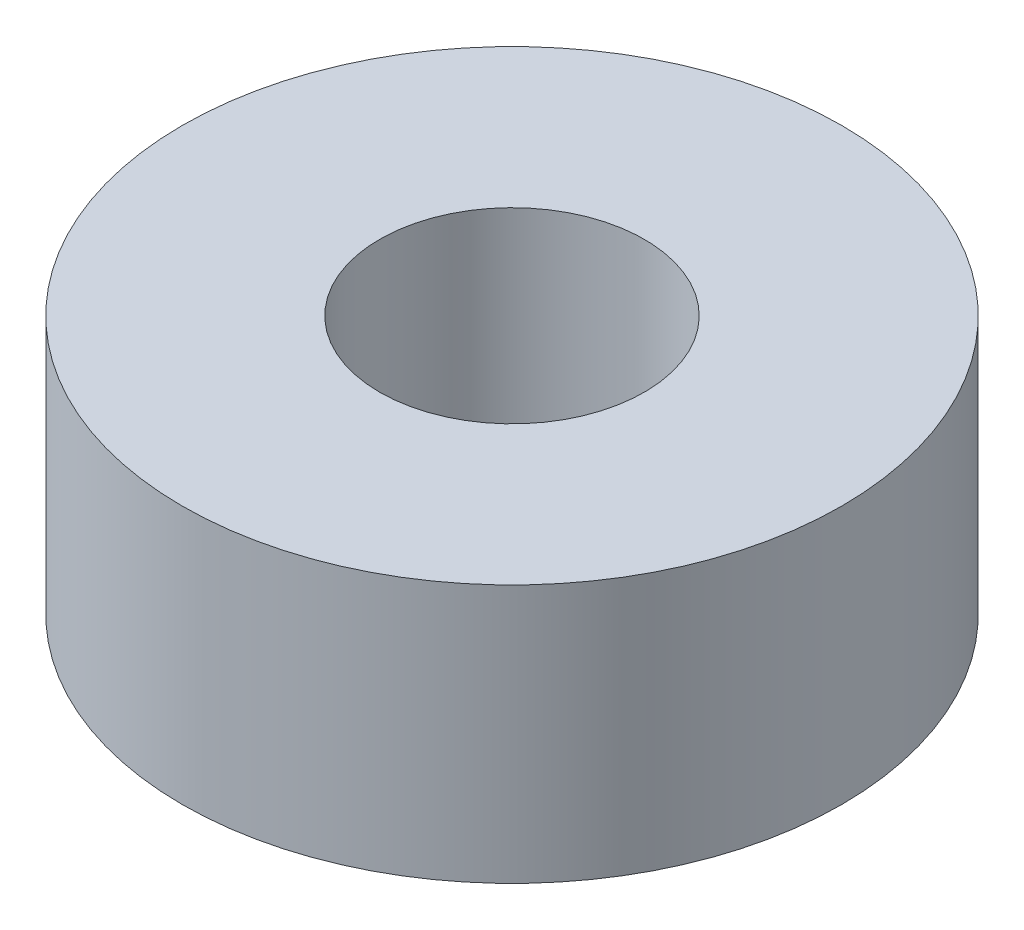
ISO-10303-21;
HEADER;
FILE_DESCRIPTION(('STEP AP214'),'2;1');
FILE_NAME('part.step','',(''),(''),'','','');
FILE_SCHEMA(('AUTOMOTIVE_DESIGN { 1 0 10303 214 1 1 1 1 }'));
ENDSEC;
DATA;
#1=APPLICATION_CONTEXT('core data for automotive mechanical design processes');
#2=APPLICATION_PROTOCOL_DEFINITION('international standard','automotive_design',2000,#1);
#3=PRODUCT_CONTEXT('',#1,'mechanical');
#4=PRODUCT('Part','Part','',(#3));
#5=PRODUCT_RELATED_PRODUCT_CATEGORY('part','',(#4));
#6=PRODUCT_DEFINITION_FORMATION('','',#4);
#7=PRODUCT_DEFINITION_CONTEXT('part definition',#1,'design');
#8=PRODUCT_DEFINITION('design','',#6,#7);
#9=PRODUCT_DEFINITION_SHAPE('','',#8);
#10=(LENGTH_UNIT() NAMED_UNIT(*) SI_UNIT(.MILLI.,.METRE.));
#11=(NAMED_UNIT(*) PLANE_ANGLE_UNIT() SI_UNIT($,.RADIAN.));
#12=(NAMED_UNIT(*) SI_UNIT($,.STERADIAN.) SOLID_ANGLE_UNIT());
#13=UNCERTAINTY_MEASURE_WITH_UNIT(LENGTH_MEASURE(1.E-05),#10,'distance_accuracy_value','');
#14=(GEOMETRIC_REPRESENTATION_CONTEXT(3) GLOBAL_UNCERTAINTY_ASSIGNED_CONTEXT((#13)) GLOBAL_UNIT_ASSIGNED_CONTEXT((#10,
#11,#12)) REPRESENTATION_CONTEXT('',''));
#15=CARTESIAN_POINT('',(0.,0.,0.));
#16=DIRECTION('',(0.,0.,1.));
#17=DIRECTION('',(1.,0.,0.));
#18=AXIS2_PLACEMENT_3D('',#15,#16,#17);
#19=CARTESIAN_POINT('',(0.,4.9784,0.));
#20=DIRECTION('',(0.,1.,0.));
#21=DIRECTION('',(0.,0.,1.));
#22=AXIS2_PLACEMENT_3D('',#19,#20,#21);
#23=PLANE('',#22);
#24=CARTESIAN_POINT('',(0.,4.9784,0.));
#25=DIRECTION('',(0.,1.,0.));
#26=DIRECTION('',(0.,0.,1.));
#27=AXIS2_PLACEMENT_3D('',#24,#25,#26);
#28=CIRCLE('',#27,6.35);
#29=CARTESIAN_POINT('',(0.,4.9784,6.35));
#30=VERTEX_POINT('',#29);
#31=EDGE_CURVE('E10',#30,#30,#28,.T.);
#32=ORIENTED_EDGE('',*,*,#31,.T.);
#33=EDGE_LOOP('',(#32));
#34=FACE_BOUND('',#33,.T.);
#35=CARTESIAN_POINT('',(0.,4.9784,0.));
#36=DIRECTION('',(0.,1.,0.));
#37=DIRECTION('',(0.,0.,1.));
#38=AXIS2_PLACEMENT_3D('',#35,#36,#37);
#39=CIRCLE('',#38,2.55);
#40=CARTESIAN_POINT('',(0.,4.9784,2.55));
#41=VERTEX_POINT('',#40);
#42=EDGE_CURVE('E42',#41,#41,#39,.T.);
#43=ORIENTED_EDGE('',*,*,#42,.F.);
#44=EDGE_LOOP('',(#43));
#45=FACE_BOUND('',#44,.T.);
#46=ADVANCED_FACE('F31',(#34,#45),#23,.T.);
#47=CARTESIAN_POINT('',(0.,0.,0.));
#48=DIRECTION('',(0.,1.,0.));
#49=DIRECTION('',(0.,0.,1.));
#50=AXIS2_PLACEMENT_3D('',#47,#48,#49);
#51=PLANE('',#50);
#52=CARTESIAN_POINT('',(0.,0.,0.));
#53=DIRECTION('',(0.,1.,0.));
#54=DIRECTION('',(0.,0.,1.));
#55=AXIS2_PLACEMENT_3D('',#52,#53,#54);
#56=CIRCLE('',#55,6.35);
#57=CARTESIAN_POINT('',(0.,0.,6.35));
#58=VERTEX_POINT('',#57);
#59=EDGE_CURVE('E35',#58,#58,#56,.T.);
#60=ORIENTED_EDGE('',*,*,#59,.F.);
#61=EDGE_LOOP('',(#60));
#62=FACE_BOUND('',#61,.T.);
#63=CARTESIAN_POINT('',(0.,0.,0.));
#64=DIRECTION('',(0.,1.,0.));
#65=DIRECTION('',(0.,0.,1.));
#66=AXIS2_PLACEMENT_3D('',#63,#64,#65);
#67=CIRCLE('',#66,2.55);
#68=CARTESIAN_POINT('',(0.,0.,2.55));
#69=VERTEX_POINT('',#68);
#70=EDGE_CURVE('E44',#69,#69,#67,.T.);
#71=ORIENTED_EDGE('',*,*,#70,.T.);
#72=EDGE_LOOP('',(#71));
#73=FACE_BOUND('',#72,.T.);
#74=ADVANCED_FACE('F54',(#62,#73),#51,.F.);
#75=CARTESIAN_POINT('',(0.,4.9784,0.));
#76=DIRECTION('',(0.,-1.,0.));
#77=DIRECTION('',(0.,0.,-1.));
#78=AXIS2_PLACEMENT_3D('',#75,#76,#77);
#79=CYLINDRICAL_SURFACE('',#78,6.35);
#80=ORIENTED_EDGE('',*,*,#31,.F.);
#81=EDGE_LOOP('',(#80));
#82=FACE_BOUND('',#81,.T.);
#83=ORIENTED_EDGE('',*,*,#59,.T.);
#84=EDGE_LOOP('',(#83));
#85=FACE_BOUND('',#84,.T.);
#86=ADVANCED_FACE('F33',(#82,#85),#79,.T.);
#87=CARTESIAN_POINT('',(0.,4.9784,0.));
#88=DIRECTION('',(0.,-1.,0.));
#89=DIRECTION('',(0.,0.,-1.));
#90=AXIS2_PLACEMENT_3D('',#87,#88,#89);
#91=CYLINDRICAL_SURFACE('',#90,2.55);
#92=ORIENTED_EDGE('',*,*,#42,.T.);
#93=EDGE_LOOP('',(#92));
#94=FACE_BOUND('',#93,.T.);
#95=ORIENTED_EDGE('',*,*,#70,.F.);
#96=EDGE_LOOP('',(#95));
#97=FACE_BOUND('',#96,.T.);
#98=ADVANCED_FACE('F50',(#94,#97),#91,.F.);
#99=CLOSED_SHELL('',(#46,#74,#86,#98));
#100=MANIFOLD_SOLID_BREP('B2',#99);
#101=ADVANCED_BREP_SHAPE_REPRESENTATION('',(#18,#100),#14);
#102=SHAPE_DEFINITION_REPRESENTATION(#9,#101);
ENDSEC;
END-ISO-10303-21;
